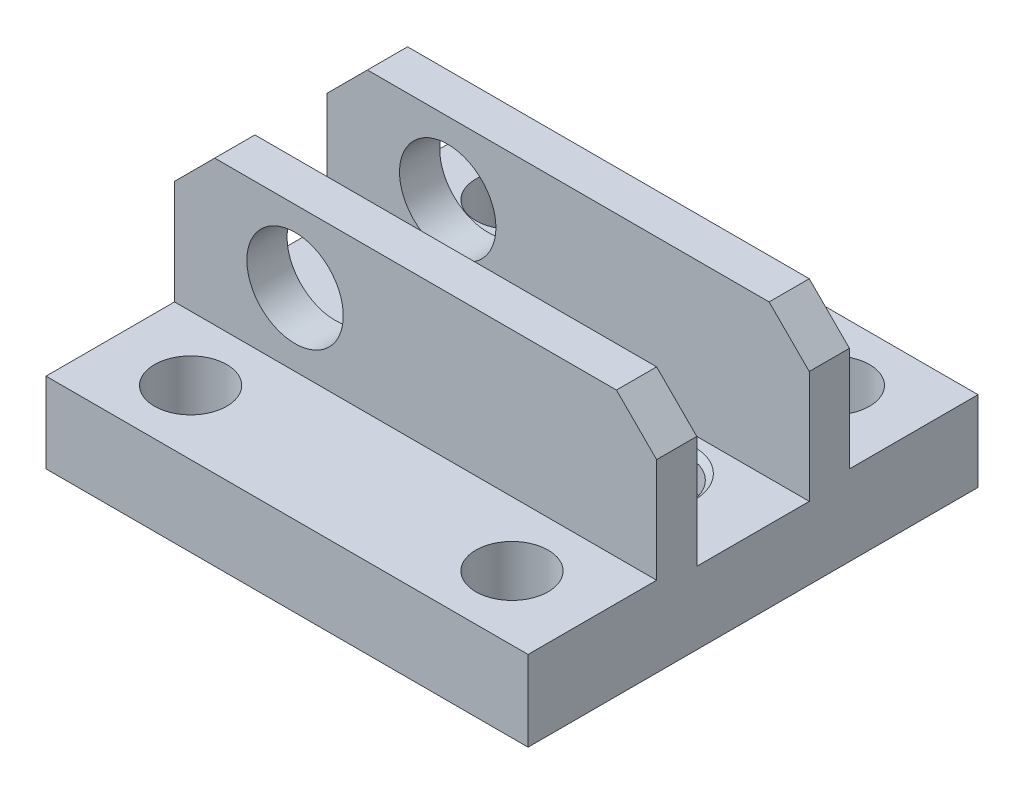
ISO-10303-21;
HEADER;
FILE_DESCRIPTION(('STEP AP214'),'2;1');
FILE_NAME('part.step','',(''),(''),'','','');
FILE_SCHEMA(('AUTOMOTIVE_DESIGN { 1 0 10303 214 1 1 1 1 }'));
ENDSEC;
DATA;
#1=APPLICATION_CONTEXT('core data for automotive mechanical design processes');
#2=APPLICATION_PROTOCOL_DEFINITION('international standard','automotive_design',2000,#1);
#3=PRODUCT_CONTEXT('',#1,'mechanical');
#4=PRODUCT('Part','Part','',(#3));
#5=PRODUCT_RELATED_PRODUCT_CATEGORY('part','',(#4));
#6=PRODUCT_DEFINITION_FORMATION('','',#4);
#7=PRODUCT_DEFINITION_CONTEXT('part definition',#1,'design');
#8=PRODUCT_DEFINITION('design','',#6,#7);
#9=PRODUCT_DEFINITION_SHAPE('','',#8);
#10=(LENGTH_UNIT() NAMED_UNIT(*) SI_UNIT(.MILLI.,.METRE.));
#11=(NAMED_UNIT(*) PLANE_ANGLE_UNIT() SI_UNIT($,.RADIAN.));
#12=(NAMED_UNIT(*) SI_UNIT($,.STERADIAN.) SOLID_ANGLE_UNIT());
#13=UNCERTAINTY_MEASURE_WITH_UNIT(LENGTH_MEASURE(1.E-05),#10,'distance_accuracy_value','');
#14=(GEOMETRIC_REPRESENTATION_CONTEXT(3) GLOBAL_UNCERTAINTY_ASSIGNED_CONTEXT((#13)) GLOBAL_UNIT_ASSIGNED_CONTEXT((#10,
#11,#12)) REPRESENTATION_CONTEXT('',''));
#15=CARTESIAN_POINT('',(0.,0.,0.));
#16=DIRECTION('',(0.,0.,1.));
#17=DIRECTION('',(1.,0.,0.));
#18=AXIS2_PLACEMENT_3D('',#15,#16,#17);
#19=CARTESIAN_POINT('',(2.5,14.,14.));
#20=DIRECTION('',(0.707106781186548,-0.707106781186548,0.));
#21=DIRECTION('',(0.707106781186547,0.707106781186548,0.));
#22=AXIS2_PLACEMENT_3D('',#19,#20,#21);
#23=PLANE('',#22);
#24=DIRECTION('',(0.,0.,-1.));
#25=VECTOR('',#24,1.);
#26=CARTESIAN_POINT('',(2.5,14.,14.));
#27=LINE('',#26,#25);
#28=CARTESIAN_POINT('',(2.5,14.,-3.5));
#29=VERTEX_POINT('',#28);
#30=CARTESIAN_POINT('',(2.5,14.,-6.));
#31=VERTEX_POINT('',#30);
#32=EDGE_CURVE('E168',#29,#31,#27,.T.);
#33=ORIENTED_EDGE('',*,*,#32,.T.);
#34=DIRECTION('',(-0.707106781186547,-0.707106781186548,0.));
#35=VECTOR('',#34,1.);
#36=CARTESIAN_POINT('',(2.5,14.,-6.));
#37=LINE('',#36,#35);
#38=CARTESIAN_POINT('',(0.,11.5,-6.));
#39=VERTEX_POINT('',#38);
#40=EDGE_CURVE('E247',#31,#39,#37,.T.);
#41=ORIENTED_EDGE('',*,*,#40,.T.);
#42=DIRECTION('',(0.,0.,-1.));
#43=VECTOR('',#42,1.);
#44=CARTESIAN_POINT('',(0.,11.5,14.));
#45=LINE('',#44,#43);
#46=CARTESIAN_POINT('',(0.,11.5,-3.5));
#47=VERTEX_POINT('',#46);
#48=EDGE_CURVE('E41',#47,#39,#45,.T.);
#49=ORIENTED_EDGE('',*,*,#48,.F.);
#50=DIRECTION('',(-0.707106781186547,-0.707106781186548,0.));
#51=VECTOR('',#50,1.);
#52=CARTESIAN_POINT('',(2.5,14.,-3.5));
#53=LINE('',#52,#51);
#54=EDGE_CURVE('E195',#29,#47,#53,.T.);
#55=ORIENTED_EDGE('',*,*,#54,.F.);
#56=EDGE_LOOP('',(#33,#41,#49,#55));
#57=FACE_BOUND('',#56,.T.);
#58=ADVANCED_FACE('F32',(#57),#23,.F.);
#59=CARTESIAN_POINT('',(30.,11.5,14.));
#60=DIRECTION('',(-0.707106781186548,-0.707106781186547,0.));
#61=DIRECTION('',(0.707106781186547,-0.707106781186548,0.));
#62=AXIS2_PLACEMENT_3D('',#59,#60,#61);
#63=PLANE('',#62);
#64=DIRECTION('',(0.,0.,-1.));
#65=VECTOR('',#64,1.);
#66=CARTESIAN_POINT('',(30.,11.5,14.));
#67=LINE('',#66,#65);
#68=CARTESIAN_POINT('',(30.,11.5,-3.5));
#69=VERTEX_POINT('',#68);
#70=CARTESIAN_POINT('',(30.,11.5,-6.));
#71=VERTEX_POINT('',#70);
#72=EDGE_CURVE('E180',#69,#71,#67,.T.);
#73=ORIENTED_EDGE('',*,*,#72,.T.);
#74=DIRECTION('',(-0.707106781186547,0.707106781186548,0.));
#75=VECTOR('',#74,1.);
#76=CARTESIAN_POINT('',(30.,11.5,-6.));
#77=LINE('',#76,#75);
#78=CARTESIAN_POINT('',(27.5,14.,-6.));
#79=VERTEX_POINT('',#78);
#80=EDGE_CURVE('E244',#71,#79,#77,.T.);
#81=ORIENTED_EDGE('',*,*,#80,.T.);
#82=DIRECTION('',(0.,0.,-1.));
#83=VECTOR('',#82,1.);
#84=CARTESIAN_POINT('',(27.5,14.,14.));
#85=LINE('',#84,#83);
#86=CARTESIAN_POINT('',(27.5,14.,-3.5));
#87=VERTEX_POINT('',#86);
#88=EDGE_CURVE('E177',#87,#79,#85,.T.);
#89=ORIENTED_EDGE('',*,*,#88,.F.);
#90=DIRECTION('',(-0.707106781186547,0.707106781186548,0.));
#91=VECTOR('',#90,1.);
#92=CARTESIAN_POINT('',(30.,11.5,-3.5));
#93=LINE('',#92,#91);
#94=EDGE_CURVE('E190',#69,#87,#93,.T.);
#95=ORIENTED_EDGE('',*,*,#94,.F.);
#96=EDGE_LOOP('',(#73,#81,#89,#95));
#97=FACE_BOUND('',#96,.T.);
#98=ADVANCED_FACE('F303',(#97),#63,.F.);
#99=CARTESIAN_POINT('',(27.5,14.,14.));
#100=DIRECTION('',(0.,-1.,0.));
#101=DIRECTION('',(0.,0.,-1.));
#102=AXIS2_PLACEMENT_3D('',#99,#100,#101);
#103=PLANE('',#102);
#104=ORIENTED_EDGE('',*,*,#88,.T.);
#105=DIRECTION('',(-1.,0.,0.));
#106=VECTOR('',#105,1.);
#107=CARTESIAN_POINT('',(30.,14.,-6.));
#108=LINE('',#107,#106);
#109=EDGE_CURVE('E231',#79,#31,#108,.T.);
#110=ORIENTED_EDGE('',*,*,#109,.T.);
#111=ORIENTED_EDGE('',*,*,#32,.F.);
#112=DIRECTION('',(-1.,0.,0.));
#113=VECTOR('',#112,1.);
#114=CARTESIAN_POINT('',(30.,14.,-3.5));
#115=LINE('',#114,#113);
#116=EDGE_CURVE('E259',#87,#29,#115,.T.);
#117=ORIENTED_EDGE('',*,*,#116,.F.);
#118=EDGE_LOOP('',(#104,#110,#111,#117));
#119=FACE_BOUND('',#118,.T.);
#120=ADVANCED_FACE('F326',(#119),#103,.F.);
#121=CARTESIAN_POINT('',(7.5,9.5,14.));
#122=DIRECTION('',(0.,0.,-1.));
#123=DIRECTION('',(-1.,0.,0.));
#124=AXIS2_PLACEMENT_3D('',#121,#122,#123);
#125=CYLINDRICAL_SURFACE('',#124,3.);
#126=CARTESIAN_POINT('',(7.5,9.5,-6.));
#127=DIRECTION('',(0.,0.,1.));
#128=DIRECTION('',(1.,0.,0.));
#129=AXIS2_PLACEMENT_3D('',#126,#127,#128);
#130=CIRCLE('',#129,3.);
#131=CARTESIAN_POINT('',(10.5,9.5,-6.));
#132=VERTEX_POINT('',#131);
#133=EDGE_CURVE('E241',#132,#132,#130,.T.);
#134=ORIENTED_EDGE('',*,*,#133,.F.);
#135=EDGE_LOOP('',(#134));
#136=FACE_BOUND('',#135,.T.);
#137=CARTESIAN_POINT('',(7.5,9.5,-3.5));
#138=DIRECTION('',(0.,0.,1.));
#139=DIRECTION('',(1.,0.,0.));
#140=AXIS2_PLACEMENT_3D('',#137,#138,#139);
#141=CIRCLE('',#140,3.);
#142=CARTESIAN_POINT('',(10.5,9.5,-3.5));
#143=VERTEX_POINT('',#142);
#144=EDGE_CURVE('E188',#143,#143,#141,.T.);
#145=ORIENTED_EDGE('',*,*,#144,.T.);
#146=EDGE_LOOP('',(#145));
#147=FACE_BOUND('',#146,.T.);
#148=ADVANCED_FACE('F353',(#136,#147),#125,.F.);
#149=CARTESIAN_POINT('',(0.,11.5,6.));
#150=VERTEX_POINT('',#149);
#151=CARTESIAN_POINT('',(0.,11.5,3.5));
#152=VERTEX_POINT('',#151);
#153=EDGE_CURVE('E11',#150,#152,#45,.T.);
#154=ORIENTED_EDGE('',*,*,#153,.F.);
#155=DIRECTION('',(0.707106781186547,0.707106781186548,0.));
#156=VECTOR('',#155,1.);
#157=CARTESIAN_POINT('',(2.5,14.,6.));
#158=LINE('',#157,#156);
#159=CARTESIAN_POINT('',(2.5,14.,6.));
#160=VERTEX_POINT('',#159);
#161=EDGE_CURVE('E238',#150,#160,#158,.T.);
#162=ORIENTED_EDGE('',*,*,#161,.T.);
#163=CARTESIAN_POINT('',(2.5,14.,3.5));
#164=VERTEX_POINT('',#163);
#165=EDGE_CURVE('E171',#160,#164,#27,.T.);
#166=ORIENTED_EDGE('',*,*,#165,.T.);
#167=DIRECTION('',(-0.707106781186547,-0.707106781186548,0.));
#168=VECTOR('',#167,1.);
#169=CARTESIAN_POINT('',(2.5,14.,3.5));
#170=LINE('',#169,#168);
#171=EDGE_CURVE('E199',#164,#152,#170,.T.);
#172=ORIENTED_EDGE('',*,*,#171,.T.);
#173=EDGE_LOOP('',(#154,#162,#166,#172));
#174=FACE_BOUND('',#173,.T.);
#175=ADVANCED_FACE('F34',(#174),#23,.F.);
#176=CARTESIAN_POINT('',(0.,11.5,14.));
#177=DIRECTION('',(1.,0.,0.));
#178=DIRECTION('',(0.,0.,-1.));
#179=AXIS2_PLACEMENT_3D('',#176,#177,#178);
#180=PLANE('',#179);
#181=DIRECTION('',(0.,1.,0.));
#182=VECTOR('',#181,1.);
#183=CARTESIAN_POINT('',(0.,5.,-6.));
#184=LINE('',#183,#182);
#185=CARTESIAN_POINT('',(0.,5.,-6.));
#186=VERTEX_POINT('',#185);
#187=EDGE_CURVE('E318',#186,#39,#184,.T.);
#188=ORIENTED_EDGE('',*,*,#187,.F.);
#189=DIRECTION('',(0.,0.,1.));
#190=VECTOR('',#189,1.);
#191=CARTESIAN_POINT('',(0.,5.,-14.));
#192=LINE('',#191,#190);
#193=CARTESIAN_POINT('',(0.,5.,-14.));
#194=VERTEX_POINT('',#193);
#195=EDGE_CURVE('E315',#194,#186,#192,.T.);
#196=ORIENTED_EDGE('',*,*,#195,.F.);
#197=DIRECTION('',(0.,-1.,0.));
#198=VECTOR('',#197,1.);
#199=CARTESIAN_POINT('',(0.,11.5,-14.));
#200=LINE('',#199,#198);
#201=CARTESIAN_POINT('',(0.,0.,-14.));
#202=VERTEX_POINT('',#201);
#203=EDGE_CURVE('E210',#194,#202,#200,.T.);
#204=ORIENTED_EDGE('',*,*,#203,.T.);
#205=DIRECTION('',(0.,0.,-1.));
#206=VECTOR('',#205,1.);
#207=CARTESIAN_POINT('',(0.,0.,14.));
#208=LINE('',#207,#206);
#209=CARTESIAN_POINT('',(0.,0.,14.));
#210=VERTEX_POINT('',#209);
#211=EDGE_CURVE('E185',#210,#202,#208,.T.);
#212=ORIENTED_EDGE('',*,*,#211,.F.);
#213=DIRECTION('',(0.,-1.,0.));
#214=VECTOR('',#213,1.);
#215=CARTESIAN_POINT('',(0.,11.5,14.));
#216=LINE('',#215,#214);
#217=CARTESIAN_POINT('',(0.,5.,14.));
#218=VERTEX_POINT('',#217);
#219=EDGE_CURVE('E173',#218,#210,#216,.T.);
#220=ORIENTED_EDGE('',*,*,#219,.F.);
#221=DIRECTION('',(0.,0.,1.));
#222=VECTOR('',#221,1.);
#223=CARTESIAN_POINT('',(0.,5.,6.));
#224=LINE('',#223,#222);
#225=CARTESIAN_POINT('',(0.,5.,6.));
#226=VERTEX_POINT('',#225);
#227=EDGE_CURVE('E49',#226,#218,#224,.T.);
#228=ORIENTED_EDGE('',*,*,#227,.F.);
#229=DIRECTION('',(0.,-1.,0.));
#230=VECTOR('',#229,1.);
#231=CARTESIAN_POINT('',(0.,14.,6.));
#232=LINE('',#231,#230);
#233=EDGE_CURVE('E162',#150,#226,#232,.T.);
#234=ORIENTED_EDGE('',*,*,#233,.F.);
#235=ORIENTED_EDGE('',*,*,#153,.T.);
#236=DIRECTION('',(0.,-1.,0.));
#237=VECTOR('',#236,1.);
#238=CARTESIAN_POINT('',(0.,14.,3.5));
#239=LINE('',#238,#237);
#240=CARTESIAN_POINT('',(0.,4.5,3.5));
#241=VERTEX_POINT('',#240);
#242=EDGE_CURVE('E271',#152,#241,#239,.T.);
#243=ORIENTED_EDGE('',*,*,#242,.T.);
#244=DIRECTION('',(0.,0.,-1.));
#245=VECTOR('',#244,1.);
#246=CARTESIAN_POINT('',(0.,4.5,3.5));
#247=LINE('',#246,#245);
#248=CARTESIAN_POINT('',(0.,4.5,-3.5));
#249=VERTEX_POINT('',#248);
#250=EDGE_CURVE('E191',#241,#249,#247,.T.);
#251=ORIENTED_EDGE('',*,*,#250,.T.);
#252=DIRECTION('',(0.,-1.,0.));
#253=VECTOR('',#252,1.);
#254=CARTESIAN_POINT('',(0.,14.,-3.5));
#255=LINE('',#254,#253);
#256=EDGE_CURVE('E261',#47,#249,#255,.T.);
#257=ORIENTED_EDGE('',*,*,#256,.F.);
#258=ORIENTED_EDGE('',*,*,#48,.T.);
#259=EDGE_LOOP('',(#188,#196,#204,#212,#220,#228,#234,#235,#243,#251,#257,#258));
#260=FACE_BOUND('',#259,.T.);
#261=ADVANCED_FACE('F219',(#260),#180,.F.);
#262=CARTESIAN_POINT('',(0.,0.,14.));
#263=DIRECTION('',(0.,1.,0.));
#264=DIRECTION('',(0.,0.,1.));
#265=AXIS2_PLACEMENT_3D('',#262,#263,#264);
#266=PLANE('',#265);
#267=CARTESIAN_POINT('',(5.,0.,-10.));
#268=DIRECTION('',(0.,1.,0.));
#269=DIRECTION('',(0.,0.,1.));
#270=AXIS2_PLACEMENT_3D('',#267,#268,#269);
#271=CIRCLE('',#270,2.25);
#272=CARTESIAN_POINT('',(5.,0.,-7.75));
#273=VERTEX_POINT('',#272);
#274=EDGE_CURVE('E388',#273,#273,#271,.T.);
#275=ORIENTED_EDGE('',*,*,#274,.T.);
#276=EDGE_LOOP('',(#275));
#277=FACE_BOUND('',#276,.T.);
#278=CARTESIAN_POINT('',(25.,0.,10.));
#279=DIRECTION('',(0.,1.,0.));
#280=DIRECTION('',(0.,0.,1.));
#281=AXIS2_PLACEMENT_3D('',#278,#279,#280);
#282=CIRCLE('',#281,2.25);
#283=CARTESIAN_POINT('',(25.,0.,12.25));
#284=VERTEX_POINT('',#283);
#285=EDGE_CURVE('E392',#284,#284,#282,.T.);
#286=ORIENTED_EDGE('',*,*,#285,.T.);
#287=EDGE_LOOP('',(#286));
#288=FACE_BOUND('',#287,.T.);
#289=CARTESIAN_POINT('',(25.,0.,-10.));
#290=DIRECTION('',(0.,1.,0.));
#291=DIRECTION('',(0.,0.,1.));
#292=AXIS2_PLACEMENT_3D('',#289,#290,#291);
#293=CIRCLE('',#292,2.25);
#294=CARTESIAN_POINT('',(25.,0.,-7.75));
#295=VERTEX_POINT('',#294);
#296=EDGE_CURVE('E396',#295,#295,#293,.T.);
#297=ORIENTED_EDGE('',*,*,#296,.T.);
#298=EDGE_LOOP('',(#297));
#299=FACE_BOUND('',#298,.T.);
#300=CARTESIAN_POINT('',(5.,0.,10.));
#301=DIRECTION('',(0.,1.,0.));
#302=DIRECTION('',(0.,0.,1.));
#303=AXIS2_PLACEMENT_3D('',#300,#301,#302);
#304=CIRCLE('',#303,2.25);
#305=CARTESIAN_POINT('',(5.,0.,12.25));
#306=VERTEX_POINT('',#305);
#307=EDGE_CURVE('E399',#306,#306,#304,.T.);
#308=ORIENTED_EDGE('',*,*,#307,.T.);
#309=EDGE_LOOP('',(#308));
#310=FACE_BOUND('',#309,.T.);
#311=ORIENTED_EDGE('',*,*,#211,.T.);
#312=DIRECTION('',(1.,0.,0.));
#313=VECTOR('',#312,1.);
#314=CARTESIAN_POINT('',(0.,0.,-14.));
#315=LINE('',#314,#313);
#316=CARTESIAN_POINT('',(30.,0.,-14.));
#317=VERTEX_POINT('',#316);
#318=EDGE_CURVE('E212',#202,#317,#315,.T.);
#319=ORIENTED_EDGE('',*,*,#318,.T.);
#320=DIRECTION('',(0.,0.,-1.));
#321=VECTOR('',#320,1.);
#322=CARTESIAN_POINT('',(30.,0.,14.));
#323=LINE('',#322,#321);
#324=CARTESIAN_POINT('',(30.,0.,14.));
#325=VERTEX_POINT('',#324);
#326=EDGE_CURVE('E183',#325,#317,#323,.T.);
#327=ORIENTED_EDGE('',*,*,#326,.F.);
#328=DIRECTION('',(1.,0.,0.));
#329=VECTOR('',#328,1.);
#330=CARTESIAN_POINT('',(0.,0.,14.));
#331=LINE('',#330,#329);
#332=EDGE_CURVE('E166',#210,#325,#331,.T.);
#333=ORIENTED_EDGE('',*,*,#332,.F.);
#334=EDGE_LOOP('',(#311,#319,#327,#333));
#335=FACE_BOUND('',#334,.T.);
#336=ADVANCED_FACE('F224',(#277,#288,#299,#310,#335),#266,.F.);
#337=CARTESIAN_POINT('',(30.,0.,14.));
#338=DIRECTION('',(-1.,0.,0.));
#339=DIRECTION('',(0.,0.,1.));
#340=AXIS2_PLACEMENT_3D('',#337,#338,#339);
#341=PLANE('',#340);
#342=DIRECTION('',(0.,1.,0.));
#343=VECTOR('',#342,1.);
#344=CARTESIAN_POINT('',(30.,0.,-14.));
#345=LINE('',#344,#343);
#346=CARTESIAN_POINT('',(30.,5.,-14.));
#347=VERTEX_POINT('',#346);
#348=EDGE_CURVE('E215',#317,#347,#345,.T.);
#349=ORIENTED_EDGE('',*,*,#348,.T.);
#350=DIRECTION('',(0.,0.,1.));
#351=VECTOR('',#350,1.);
#352=CARTESIAN_POINT('',(30.,5.,-14.));
#353=LINE('',#352,#351);
#354=CARTESIAN_POINT('',(30.,5.,-6.));
#355=VERTEX_POINT('',#354);
#356=EDGE_CURVE('E57',#347,#355,#353,.T.);
#357=ORIENTED_EDGE('',*,*,#356,.T.);
#358=DIRECTION('',(0.,1.,0.));
#359=VECTOR('',#358,1.);
#360=CARTESIAN_POINT('',(30.,5.,-6.));
#361=LINE('',#360,#359);
#362=EDGE_CURVE('E307',#355,#71,#361,.T.);
#363=ORIENTED_EDGE('',*,*,#362,.T.);
#364=ORIENTED_EDGE('',*,*,#72,.F.);
#365=DIRECTION('',(0.,1.,0.));
#366=VECTOR('',#365,1.);
#367=CARTESIAN_POINT('',(30.,4.5,-3.5));
#368=LINE('',#367,#366);
#369=CARTESIAN_POINT('',(30.,4.5,-3.5));
#370=VERTEX_POINT('',#369);
#371=EDGE_CURVE('E266',#370,#69,#368,.T.);
#372=ORIENTED_EDGE('',*,*,#371,.F.);
#373=DIRECTION('',(0.,0.,-1.));
#374=VECTOR('',#373,1.);
#375=CARTESIAN_POINT('',(30.,4.5,3.5));
#376=LINE('',#375,#374);
#377=CARTESIAN_POINT('',(30.,4.5,3.5));
#378=VERTEX_POINT('',#377);
#379=EDGE_CURVE('E279',#378,#370,#376,.T.);
#380=ORIENTED_EDGE('',*,*,#379,.F.);
#381=DIRECTION('',(0.,1.,0.));
#382=VECTOR('',#381,1.);
#383=CARTESIAN_POINT('',(30.,4.5,3.5));
#384=LINE('',#383,#382);
#385=CARTESIAN_POINT('',(30.,11.5,3.5));
#386=VERTEX_POINT('',#385);
#387=EDGE_CURVE('E276',#378,#386,#384,.T.);
#388=ORIENTED_EDGE('',*,*,#387,.T.);
#389=CARTESIAN_POINT('',(30.,11.5,6.));
#390=VERTEX_POINT('',#389);
#391=EDGE_CURVE('E181',#390,#386,#67,.T.);
#392=ORIENTED_EDGE('',*,*,#391,.F.);
#393=DIRECTION('',(0.,-1.,0.));
#394=VECTOR('',#393,1.);
#395=CARTESIAN_POINT('',(30.,14.,6.));
#396=LINE('',#395,#394);
#397=CARTESIAN_POINT('',(30.,5.,6.));
#398=VERTEX_POINT('',#397);
#399=EDGE_CURVE('E161',#390,#398,#396,.T.);
#400=ORIENTED_EDGE('',*,*,#399,.T.);
#401=DIRECTION('',(0.,0.,1.));
#402=VECTOR('',#401,1.);
#403=CARTESIAN_POINT('',(30.,5.,6.));
#404=LINE('',#403,#402);
#405=CARTESIAN_POINT('',(30.,5.,14.));
#406=VERTEX_POINT('',#405);
#407=EDGE_CURVE('E148',#398,#406,#404,.T.);
#408=ORIENTED_EDGE('',*,*,#407,.T.);
#409=DIRECTION('',(0.,1.,0.));
#410=VECTOR('',#409,1.);
#411=CARTESIAN_POINT('',(30.,0.,14.));
#412=LINE('',#411,#410);
#413=EDGE_CURVE('E159',#325,#406,#412,.T.);
#414=ORIENTED_EDGE('',*,*,#413,.F.);
#415=ORIENTED_EDGE('',*,*,#326,.T.);
#416=EDGE_LOOP('',(#349,#357,#363,#364,#372,#380,#388,#392,#400,#408,#414,#415));
#417=FACE_BOUND('',#416,.T.);
#418=ADVANCED_FACE('F158',(#417),#341,.F.);
#419=CARTESIAN_POINT('',(27.5,14.,6.));
#420=VERTEX_POINT('',#419);
#421=CARTESIAN_POINT('',(27.5,14.,3.5));
#422=VERTEX_POINT('',#421);
#423=EDGE_CURVE('E178',#420,#422,#85,.T.);
#424=ORIENTED_EDGE('',*,*,#423,.F.);
#425=DIRECTION('',(0.707106781186547,-0.707106781186548,0.));
#426=VECTOR('',#425,1.);
#427=CARTESIAN_POINT('',(30.,11.5,6.));
#428=LINE('',#427,#426);
#429=EDGE_CURVE('E235',#420,#390,#428,.T.);
#430=ORIENTED_EDGE('',*,*,#429,.T.);
#431=ORIENTED_EDGE('',*,*,#391,.T.);
#432=DIRECTION('',(-0.707106781186547,0.707106781186548,0.));
#433=VECTOR('',#432,1.);
#434=CARTESIAN_POINT('',(30.,11.5,3.5));
#435=LINE('',#434,#433);
#436=EDGE_CURVE('E194',#386,#422,#435,.T.);
#437=ORIENTED_EDGE('',*,*,#436,.T.);
#438=EDGE_LOOP('',(#424,#430,#431,#437));
#439=FACE_BOUND('',#438,.T.);
#440=ADVANCED_FACE('F351',(#439),#63,.F.);
#441=ORIENTED_EDGE('',*,*,#165,.F.);
#442=DIRECTION('',(-1.,0.,0.));
#443=VECTOR('',#442,1.);
#444=CARTESIAN_POINT('',(30.,14.,6.));
#445=LINE('',#444,#443);
#446=EDGE_CURVE('E322',#420,#160,#445,.T.);
#447=ORIENTED_EDGE('',*,*,#446,.F.);
#448=ORIENTED_EDGE('',*,*,#423,.T.);
#449=DIRECTION('',(-1.,0.,0.));
#450=VECTOR('',#449,1.);
#451=CARTESIAN_POINT('',(30.,14.,3.5));
#452=LINE('',#451,#450);
#453=EDGE_CURVE('E268',#422,#164,#452,.T.);
#454=ORIENTED_EDGE('',*,*,#453,.T.);
#455=EDGE_LOOP('',(#441,#447,#448,#454));
#456=FACE_BOUND('',#455,.T.);
#457=ADVANCED_FACE('F370',(#456),#103,.F.);
#458=CARTESIAN_POINT('',(0.,0.,14.));
#459=DIRECTION('',(0.,0.,-1.));
#460=DIRECTION('',(-1.,0.,0.));
#461=AXIS2_PLACEMENT_3D('',#458,#459,#460);
#462=PLANE('',#461);
#463=ORIENTED_EDGE('',*,*,#413,.T.);
#464=DIRECTION('',(-1.,0.,0.));
#465=VECTOR('',#464,1.);
#466=CARTESIAN_POINT('',(30.,5.,14.));
#467=LINE('',#466,#465);
#468=EDGE_CURVE('E145',#406,#218,#467,.T.);
#469=ORIENTED_EDGE('',*,*,#468,.T.);
#470=ORIENTED_EDGE('',*,*,#219,.T.);
#471=ORIENTED_EDGE('',*,*,#332,.T.);
#472=EDGE_LOOP('',(#463,#469,#470,#471));
#473=FACE_BOUND('',#472,.T.);
#474=ADVANCED_FACE('F164',(#473),#462,.F.);
#475=CARTESIAN_POINT('',(0.,0.,-14.));
#476=DIRECTION('',(0.,0.,-1.));
#477=DIRECTION('',(-1.,0.,0.));
#478=AXIS2_PLACEMENT_3D('',#475,#476,#477);
#479=PLANE('',#478);
#480=DIRECTION('',(-1.,0.,0.));
#481=VECTOR('',#480,1.);
#482=CARTESIAN_POINT('',(30.,5.,-14.));
#483=LINE('',#482,#481);
#484=EDGE_CURVE('E153',#347,#194,#483,.T.);
#485=ORIENTED_EDGE('',*,*,#484,.F.);
#486=ORIENTED_EDGE('',*,*,#348,.F.);
#487=ORIENTED_EDGE('',*,*,#318,.F.);
#488=ORIENTED_EDGE('',*,*,#203,.F.);
#489=EDGE_LOOP('',(#485,#486,#487,#488));
#490=FACE_BOUND('',#489,.T.);
#491=ADVANCED_FACE('F227',(#490),#479,.T.);
#492=CARTESIAN_POINT('',(7.5,9.5,6.));
#493=DIRECTION('',(0.,0.,-1.));
#494=DIRECTION('',(-1.,0.,0.));
#495=AXIS2_PLACEMENT_3D('',#492,#493,#494);
#496=CIRCLE('',#495,3.);
#497=CARTESIAN_POINT('',(4.5,9.5,6.));
#498=VERTEX_POINT('',#497);
#499=EDGE_CURVE('E36',#498,#498,#496,.T.);
#500=ORIENTED_EDGE('',*,*,#499,.F.);
#501=EDGE_LOOP('',(#500));
#502=FACE_BOUND('',#501,.T.);
#503=CARTESIAN_POINT('',(7.5,9.5,3.5));
#504=DIRECTION('',(0.,0.,1.));
#505=DIRECTION('',(1.,0.,0.));
#506=AXIS2_PLACEMENT_3D('',#503,#504,#505);
#507=CIRCLE('',#506,3.);
#508=CARTESIAN_POINT('',(10.5,9.5,3.5));
#509=VERTEX_POINT('',#508);
#510=EDGE_CURVE('E192',#509,#509,#507,.T.);
#511=ORIENTED_EDGE('',*,*,#510,.F.);
#512=EDGE_LOOP('',(#511));
#513=FACE_BOUND('',#512,.T.);
#514=ADVANCED_FACE('F361',(#502,#513),#125,.F.);
#515=CARTESIAN_POINT('',(0.,0.,3.5));
#516=DIRECTION('',(0.,0.,1.));
#517=DIRECTION('',(1.,0.,0.));
#518=AXIS2_PLACEMENT_3D('',#515,#516,#517);
#519=PLANE('',#518);
#520=ORIENTED_EDGE('',*,*,#510,.T.);
#521=EDGE_LOOP('',(#520));
#522=FACE_BOUND('',#521,.T.);
#523=ORIENTED_EDGE('',*,*,#453,.F.);
#524=ORIENTED_EDGE('',*,*,#436,.F.);
#525=ORIENTED_EDGE('',*,*,#387,.F.);
#526=DIRECTION('',(1.,0.,0.));
#527=VECTOR('',#526,1.);
#528=CARTESIAN_POINT('',(0.,4.5,3.5));
#529=LINE('',#528,#527);
#530=EDGE_CURVE('E274',#241,#378,#529,.T.);
#531=ORIENTED_EDGE('',*,*,#530,.F.);
#532=ORIENTED_EDGE('',*,*,#242,.F.);
#533=ORIENTED_EDGE('',*,*,#171,.F.);
#534=EDGE_LOOP('',(#523,#524,#525,#531,#532,#533));
#535=FACE_BOUND('',#534,.T.);
#536=ADVANCED_FACE('F291',(#522,#535),#519,.F.);
#537=CARTESIAN_POINT('',(0.,0.,-3.5));
#538=DIRECTION('',(0.,0.,1.));
#539=DIRECTION('',(1.,0.,0.));
#540=AXIS2_PLACEMENT_3D('',#537,#538,#539);
#541=PLANE('',#540);
#542=ORIENTED_EDGE('',*,*,#144,.F.);
#543=EDGE_LOOP('',(#542));
#544=FACE_BOUND('',#543,.T.);
#545=ORIENTED_EDGE('',*,*,#54,.T.);
#546=ORIENTED_EDGE('',*,*,#256,.T.);
#547=DIRECTION('',(1.,0.,0.));
#548=VECTOR('',#547,1.);
#549=CARTESIAN_POINT('',(0.,4.5,-3.5));
#550=LINE('',#549,#548);
#551=EDGE_CURVE('E263',#249,#370,#550,.T.);
#552=ORIENTED_EDGE('',*,*,#551,.T.);
#553=ORIENTED_EDGE('',*,*,#371,.T.);
#554=ORIENTED_EDGE('',*,*,#94,.T.);
#555=ORIENTED_EDGE('',*,*,#116,.T.);
#556=EDGE_LOOP('',(#545,#546,#552,#553,#554,#555));
#557=FACE_BOUND('',#556,.T.);
#558=ADVANCED_FACE('F297',(#544,#557),#541,.T.);
#559=CARTESIAN_POINT('',(0.,4.5,3.5));
#560=DIRECTION('',(0.,1.,0.));
#561=DIRECTION('',(0.,0.,1.));
#562=AXIS2_PLACEMENT_3D('',#559,#560,#561);
#563=PLANE('',#562);
#564=CARTESIAN_POINT('',(23.5,4.5,0.));
#565=DIRECTION('',(0.,1.,0.));
#566=DIRECTION('',(0.,0.,1.));
#567=AXIS2_PLACEMENT_3D('',#564,#565,#566);
#568=CIRCLE('',#567,2.853553390593);
#569=CARTESIAN_POINT('',(23.5,4.5,2.853553390593));
#570=VERTEX_POINT('',#569);
#571=EDGE_CURVE('E256',#570,#570,#568,.T.);
#572=ORIENTED_EDGE('',*,*,#571,.F.);
#573=EDGE_LOOP('',(#572));
#574=FACE_BOUND('',#573,.T.);
#575=ORIENTED_EDGE('',*,*,#250,.F.);
#576=ORIENTED_EDGE('',*,*,#530,.T.);
#577=ORIENTED_EDGE('',*,*,#379,.T.);
#578=ORIENTED_EDGE('',*,*,#551,.F.);
#579=EDGE_LOOP('',(#575,#576,#577,#578));
#580=FACE_BOUND('',#579,.T.);
#581=ADVANCED_FACE('F287',(#574,#580),#563,.T.);
#582=CARTESIAN_POINT('',(23.5,4.1464466094067,0.));
#583=DIRECTION('',(0.,1.,0.));
#584=DIRECTION('',(0.,0.,1.));
#585=AXIS2_PLACEMENT_3D('',#582,#583,#584);
#586=CONICAL_SURFACE('',#585,2.5,0.785398163397028);
#587=ORIENTED_EDGE('',*,*,#571,.T.);
#588=EDGE_LOOP('',(#587));
#589=FACE_BOUND('',#588,.T.);
#590=CARTESIAN_POINT('',(23.5,4.1464466094067,0.));
#591=DIRECTION('',(0.,1.,0.));
#592=DIRECTION('',(0.,0.,1.));
#593=AXIS2_PLACEMENT_3D('',#590,#591,#592);
#594=CIRCLE('',#593,2.5);
#595=CARTESIAN_POINT('',(23.5,4.1464466094067,2.5));
#596=VERTEX_POINT('',#595);
#597=EDGE_CURVE('E253',#596,#596,#594,.T.);
#598=ORIENTED_EDGE('',*,*,#597,.F.);
#599=EDGE_LOOP('',(#598));
#600=FACE_BOUND('',#599,.T.);
#601=ADVANCED_FACE('F595',(#589,#600),#586,.F.);
#602=CARTESIAN_POINT('',(23.5,2.5,0.));
#603=DIRECTION('',(0.,1.,0.));
#604=DIRECTION('',(0.,0.,1.));
#605=AXIS2_PLACEMENT_3D('',#602,#603,#604);
#606=CYLINDRICAL_SURFACE('',#605,2.5);
#607=ORIENTED_EDGE('',*,*,#597,.T.);
#608=EDGE_LOOP('',(#607));
#609=FACE_BOUND('',#608,.T.);
#610=CARTESIAN_POINT('',(23.5,2.5,0.));
#611=DIRECTION('',(0.,1.,0.));
#612=DIRECTION('',(0.,0.,1.));
#613=AXIS2_PLACEMENT_3D('',#610,#611,#612);
#614=CIRCLE('',#613,2.5);
#615=CARTESIAN_POINT('',(23.5,2.5,2.5));
#616=VERTEX_POINT('',#615);
#617=EDGE_CURVE('E250',#616,#616,#614,.T.);
#618=ORIENTED_EDGE('',*,*,#617,.F.);
#619=EDGE_LOOP('',(#618));
#620=FACE_BOUND('',#619,.T.);
#621=ADVANCED_FACE('F439',(#609,#620),#606,.F.);
#622=CARTESIAN_POINT('',(26.,2.5,0.));
#623=DIRECTION('',(0.,1.,0.));
#624=DIRECTION('',(0.,0.,1.));
#625=AXIS2_PLACEMENT_3D('',#622,#623,#624);
#626=PLANE('',#625);
#627=ORIENTED_EDGE('',*,*,#617,.T.);
#628=EDGE_LOOP('',(#627));
#629=FACE_BOUND('',#628,.T.);
#630=ADVANCED_FACE('F432',(#629),#626,.T.);
#631=CARTESIAN_POINT('',(30.,14.,6.));
#632=DIRECTION('',(0.,0.,-1.));
#633=DIRECTION('',(-1.,0.,0.));
#634=AXIS2_PLACEMENT_3D('',#631,#632,#633);
#635=PLANE('',#634);
#636=ORIENTED_EDGE('',*,*,#499,.T.);
#637=EDGE_LOOP('',(#636));
#638=FACE_BOUND('',#637,.T.);
#639=ORIENTED_EDGE('',*,*,#233,.T.);
#640=DIRECTION('',(-1.,0.,0.));
#641=VECTOR('',#640,1.);
#642=CARTESIAN_POINT('',(30.,5.,6.));
#643=LINE('',#642,#641);
#644=EDGE_CURVE('E310',#398,#226,#643,.T.);
#645=ORIENTED_EDGE('',*,*,#644,.F.);
#646=ORIENTED_EDGE('',*,*,#399,.F.);
#647=ORIENTED_EDGE('',*,*,#429,.F.);
#648=ORIENTED_EDGE('',*,*,#446,.T.);
#649=ORIENTED_EDGE('',*,*,#161,.F.);
#650=EDGE_LOOP('',(#639,#645,#646,#647,#648,#649));
#651=FACE_BOUND('',#650,.T.);
#652=ADVANCED_FACE('F366',(#638,#651),#635,.F.);
#653=CARTESIAN_POINT('',(30.,5.,6.));
#654=DIRECTION('',(0.,-1.,0.));
#655=DIRECTION('',(0.,0.,-1.));
#656=AXIS2_PLACEMENT_3D('',#653,#654,#655);
#657=PLANE('',#656);
#658=CARTESIAN_POINT('',(25.,5.,10.));
#659=DIRECTION('',(0.,1.,0.));
#660=DIRECTION('',(0.,0.,1.));
#661=AXIS2_PLACEMENT_3D('',#658,#659,#660);
#662=CIRCLE('',#661,2.25);
#663=CARTESIAN_POINT('',(25.,5.,12.25));
#664=VERTEX_POINT('',#663);
#665=EDGE_CURVE('E408',#664,#664,#662,.T.);
#666=ORIENTED_EDGE('',*,*,#665,.F.);
#667=EDGE_LOOP('',(#666));
#668=FACE_BOUND('',#667,.T.);
#669=CARTESIAN_POINT('',(5.,5.,10.));
#670=DIRECTION('',(0.,1.,0.));
#671=DIRECTION('',(0.,0.,1.));
#672=AXIS2_PLACEMENT_3D('',#669,#670,#671);
#673=CIRCLE('',#672,2.25);
#674=CARTESIAN_POINT('',(5.,5.,12.25));
#675=VERTEX_POINT('',#674);
#676=EDGE_CURVE('E316',#675,#675,#673,.T.);
#677=ORIENTED_EDGE('',*,*,#676,.F.);
#678=EDGE_LOOP('',(#677));
#679=FACE_BOUND('',#678,.T.);
#680=ORIENTED_EDGE('',*,*,#227,.T.);
#681=ORIENTED_EDGE('',*,*,#468,.F.);
#682=ORIENTED_EDGE('',*,*,#407,.F.);
#683=ORIENTED_EDGE('',*,*,#644,.T.);
#684=EDGE_LOOP('',(#680,#681,#682,#683));
#685=FACE_BOUND('',#684,.T.);
#686=ADVANCED_FACE('F147',(#668,#679,#685),#657,.F.);
#687=CARTESIAN_POINT('',(30.,5.,-6.));
#688=DIRECTION('',(0.,0.,1.));
#689=DIRECTION('',(1.,0.,0.));
#690=AXIS2_PLACEMENT_3D('',#687,#688,#689);
#691=PLANE('',#690);
#692=ORIENTED_EDGE('',*,*,#133,.T.);
#693=EDGE_LOOP('',(#692));
#694=FACE_BOUND('',#693,.T.);
#695=ORIENTED_EDGE('',*,*,#109,.F.);
#696=ORIENTED_EDGE('',*,*,#80,.F.);
#697=ORIENTED_EDGE('',*,*,#362,.F.);
#698=DIRECTION('',(-1.,0.,0.));
#699=VECTOR('',#698,1.);
#700=CARTESIAN_POINT('',(30.,5.,-6.));
#701=LINE('',#700,#699);
#702=EDGE_CURVE('E229',#355,#186,#701,.T.);
#703=ORIENTED_EDGE('',*,*,#702,.T.);
#704=ORIENTED_EDGE('',*,*,#187,.T.);
#705=ORIENTED_EDGE('',*,*,#40,.F.);
#706=EDGE_LOOP('',(#695,#696,#697,#703,#704,#705));
#707=FACE_BOUND('',#706,.T.);
#708=ADVANCED_FACE('F328',(#694,#707),#691,.F.);
#709=CARTESIAN_POINT('',(30.,5.,-14.));
#710=DIRECTION('',(0.,-1.,0.));
#711=DIRECTION('',(0.,0.,-1.));
#712=AXIS2_PLACEMENT_3D('',#709,#710,#711);
#713=PLANE('',#712);
#714=CARTESIAN_POINT('',(5.,5.,-10.));
#715=DIRECTION('',(0.,1.,0.));
#716=DIRECTION('',(0.,0.,1.));
#717=AXIS2_PLACEMENT_3D('',#714,#715,#716);
#718=CIRCLE('',#717,2.25);
#719=CARTESIAN_POINT('',(5.,5.,-7.75));
#720=VERTEX_POINT('',#719);
#721=EDGE_CURVE('E411',#720,#720,#718,.T.);
#722=ORIENTED_EDGE('',*,*,#721,.F.);
#723=EDGE_LOOP('',(#722));
#724=FACE_BOUND('',#723,.T.);
#725=CARTESIAN_POINT('',(25.,5.,-10.));
#726=DIRECTION('',(0.,1.,0.));
#727=DIRECTION('',(0.,0.,1.));
#728=AXIS2_PLACEMENT_3D('',#725,#726,#727);
#729=CIRCLE('',#728,2.25);
#730=CARTESIAN_POINT('',(25.,5.,-7.75));
#731=VERTEX_POINT('',#730);
#732=EDGE_CURVE('E401',#731,#731,#729,.T.);
#733=ORIENTED_EDGE('',*,*,#732,.F.);
#734=EDGE_LOOP('',(#733));
#735=FACE_BOUND('',#734,.T.);
#736=ORIENTED_EDGE('',*,*,#195,.T.);
#737=ORIENTED_EDGE('',*,*,#702,.F.);
#738=ORIENTED_EDGE('',*,*,#356,.F.);
#739=ORIENTED_EDGE('',*,*,#484,.T.);
#740=EDGE_LOOP('',(#736,#737,#738,#739));
#741=FACE_BOUND('',#740,.T.);
#742=ADVANCED_FACE('F329',(#724,#735,#741),#713,.F.);
#743=CARTESIAN_POINT('',(5.,5.,10.));
#744=DIRECTION('',(0.,-1.,0.));
#745=DIRECTION('',(0.,0.,-1.));
#746=AXIS2_PLACEMENT_3D('',#743,#744,#745);
#747=CYLINDRICAL_SURFACE('',#746,2.25);
#748=ORIENTED_EDGE('',*,*,#676,.T.);
#749=EDGE_LOOP('',(#748));
#750=FACE_BOUND('',#749,.T.);
#751=ORIENTED_EDGE('',*,*,#307,.F.);
#752=EDGE_LOOP('',(#751));
#753=FACE_BOUND('',#752,.T.);
#754=ADVANCED_FACE('F331',(#750,#753),#747,.F.);
#755=CARTESIAN_POINT('',(25.,5.,-10.));
#756=DIRECTION('',(0.,-1.,0.));
#757=DIRECTION('',(0.,0.,-1.));
#758=AXIS2_PLACEMENT_3D('',#755,#756,#757);
#759=CYLINDRICAL_SURFACE('',#758,2.25);
#760=ORIENTED_EDGE('',*,*,#732,.T.);
#761=EDGE_LOOP('',(#760));
#762=FACE_BOUND('',#761,.T.);
#763=ORIENTED_EDGE('',*,*,#296,.F.);
#764=EDGE_LOOP('',(#763));
#765=FACE_BOUND('',#764,.T.);
#766=ADVANCED_FACE('F338',(#762,#765),#759,.F.);
#767=CARTESIAN_POINT('',(25.,5.,10.));
#768=DIRECTION('',(0.,-1.,0.));
#769=DIRECTION('',(0.,0.,-1.));
#770=AXIS2_PLACEMENT_3D('',#767,#768,#769);
#771=CYLINDRICAL_SURFACE('',#770,2.25);
#772=ORIENTED_EDGE('',*,*,#665,.T.);
#773=EDGE_LOOP('',(#772));
#774=FACE_BOUND('',#773,.T.);
#775=ORIENTED_EDGE('',*,*,#285,.F.);
#776=EDGE_LOOP('',(#775));
#777=FACE_BOUND('',#776,.T.);
#778=ADVANCED_FACE('F420',(#774,#777),#771,.F.);
#779=CARTESIAN_POINT('',(5.,5.,-10.));
#780=DIRECTION('',(0.,-1.,0.));
#781=DIRECTION('',(0.,0.,-1.));
#782=AXIS2_PLACEMENT_3D('',#779,#780,#781);
#783=CYLINDRICAL_SURFACE('',#782,2.25);
#784=ORIENTED_EDGE('',*,*,#721,.T.);
#785=EDGE_LOOP('',(#784));
#786=FACE_BOUND('',#785,.T.);
#787=ORIENTED_EDGE('',*,*,#274,.F.);
#788=EDGE_LOOP('',(#787));
#789=FACE_BOUND('',#788,.T.);
#790=ADVANCED_FACE('F417',(#786,#789),#783,.F.);
#791=CLOSED_SHELL('',(#58,#98,#120,#148,#175,#261,#336,#418,#440,#457,#474,#491,#514,#536,#558,
#581,#601,#621,#630,#652,#686,#708,#742,#754,#766,#778,#790));
#792=MANIFOLD_SOLID_BREP('B2',#791);
#793=ADVANCED_BREP_SHAPE_REPRESENTATION('',(#18,#792),#14);
#794=SHAPE_DEFINITION_REPRESENTATION(#9,#793);
ENDSEC;
END-ISO-10303-21;
